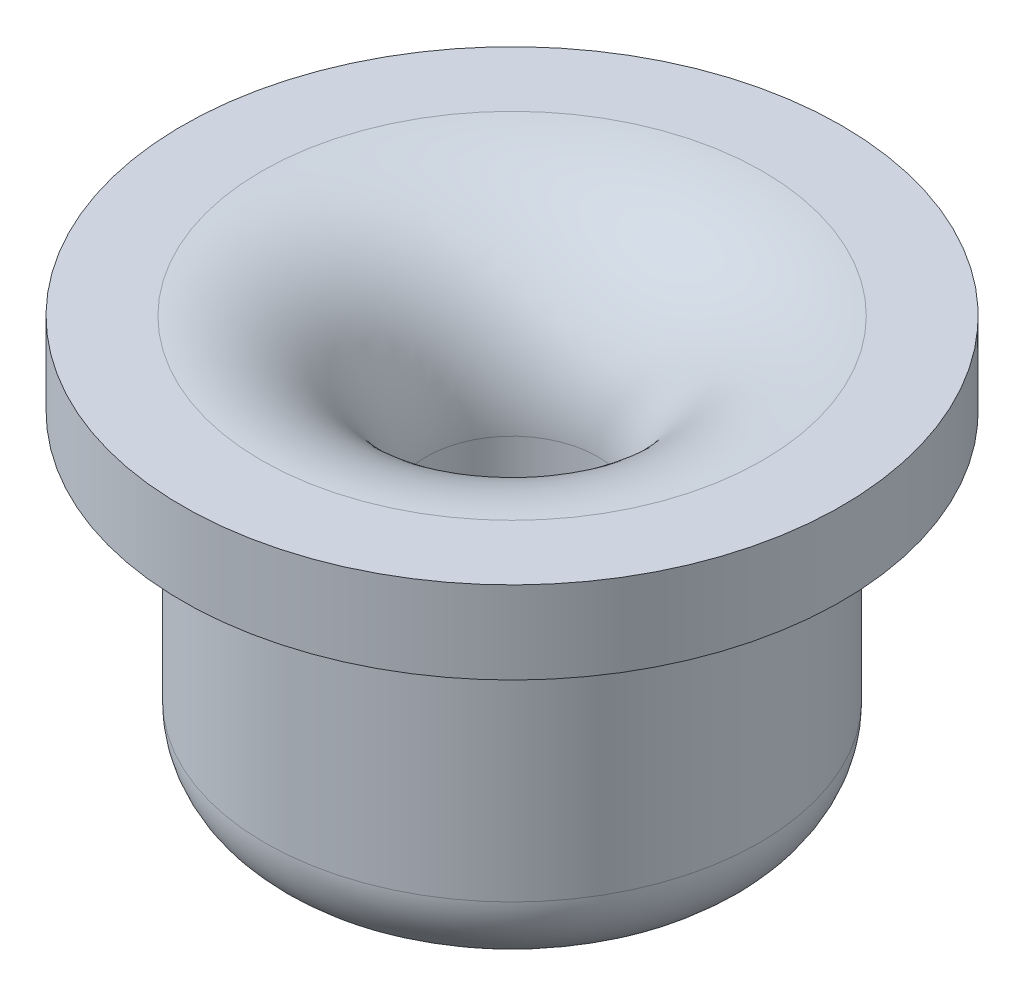
ISO-10303-21;
HEADER;
FILE_DESCRIPTION(('STEP AP214'),'2;1');
FILE_NAME('part.step','',(''),(''),'','','');
FILE_SCHEMA(('AUTOMOTIVE_DESIGN { 1 0 10303 214 1 1 1 1 }'));
ENDSEC;
DATA;
#1=APPLICATION_CONTEXT('core data for automotive mechanical design processes');
#2=APPLICATION_PROTOCOL_DEFINITION('international standard','automotive_design',2000,#1);
#3=PRODUCT_CONTEXT('',#1,'mechanical');
#4=PRODUCT('Part','Part','',(#3));
#5=PRODUCT_RELATED_PRODUCT_CATEGORY('part','',(#4));
#6=PRODUCT_DEFINITION_FORMATION('','',#4);
#7=PRODUCT_DEFINITION_CONTEXT('part definition',#1,'design');
#8=PRODUCT_DEFINITION('design','',#6,#7);
#9=PRODUCT_DEFINITION_SHAPE('','',#8);
#10=(LENGTH_UNIT() NAMED_UNIT(*) SI_UNIT(.MILLI.,.METRE.));
#11=(NAMED_UNIT(*) PLANE_ANGLE_UNIT() SI_UNIT($,.RADIAN.));
#12=(NAMED_UNIT(*) SI_UNIT($,.STERADIAN.) SOLID_ANGLE_UNIT());
#13=UNCERTAINTY_MEASURE_WITH_UNIT(LENGTH_MEASURE(1.E-05),#10,'distance_accuracy_value','');
#14=(GEOMETRIC_REPRESENTATION_CONTEXT(3) GLOBAL_UNCERTAINTY_ASSIGNED_CONTEXT((#13)) GLOBAL_UNIT_ASSIGNED_CONTEXT((#10,
#11,#12)) REPRESENTATION_CONTEXT('',''));
#15=CARTESIAN_POINT('',(0.,0.,0.));
#16=DIRECTION('',(0.,0.,1.));
#17=DIRECTION('',(1.,0.,0.));
#18=AXIS2_PLACEMENT_3D('',#15,#16,#17);
#19=CARTESIAN_POINT('',(0.,0.,4.7625));
#20=DIRECTION('',(0.,1.,0.));
#21=DIRECTION('',(0.,0.,1.));
#22=AXIS2_PLACEMENT_3D('',#19,#20,#21);
#23=PLANE('',#22);
#24=CARTESIAN_POINT('',(0.,0.,0.));
#25=DIRECTION('',(0.,1.,0.));
#26=DIRECTION('',(0.,0.,1.));
#27=AXIS2_PLACEMENT_3D('',#24,#25,#26);
#28=CIRCLE('',#27,3.2385);
#29=CARTESIAN_POINT('',(0.,0.,3.2385));
#30=VERTEX_POINT('',#29);
#31=EDGE_CURVE('E42',#30,#30,#28,.F.);
#32=ORIENTED_EDGE('',*,*,#31,.T.);
#33=EDGE_LOOP('',(#32));
#34=FACE_BOUND('',#33,.T.);
#35=CARTESIAN_POINT('',(0.,0.,0.));
#36=DIRECTION('',(0.,1.,0.));
#37=DIRECTION('',(0.,0.,1.));
#38=AXIS2_PLACEMENT_3D('',#35,#36,#37);
#39=CIRCLE('',#38,3.175);
#40=CARTESIAN_POINT('',(0.,0.,3.175));
#41=VERTEX_POINT('',#40);
#42=EDGE_CURVE('E46',#41,#41,#39,.T.);
#43=ORIENTED_EDGE('',*,*,#42,.T.);
#44=EDGE_LOOP('',(#43));
#45=FACE_BOUND('',#44,.T.);
#46=ADVANCED_FACE('F31',(#34,#45),#23,.F.);
#47=CARTESIAN_POINT('',(0.,0.,0.));
#48=DIRECTION('',(0.,-1.,0.));
#49=DIRECTION('',(0.,0.,-1.));
#50=AXIS2_PLACEMENT_3D('',#47,#48,#49);
#51=CYLINDRICAL_SURFACE('',#50,1.651);
#52=CARTESIAN_POINT('',(0.,1.524,0.));
#53=DIRECTION('',(0.,1.,0.));
#54=DIRECTION('',(0.,0.,1.));
#55=AXIS2_PLACEMENT_3D('',#52,#53,#54);
#56=CIRCLE('',#55,1.651);
#57=CARTESIAN_POINT('',(0.,1.524,1.651));
#58=VERTEX_POINT('',#57);
#59=EDGE_CURVE('E10',#58,#58,#56,.F.);
#60=ORIENTED_EDGE('',*,*,#59,.T.);
#61=EDGE_LOOP('',(#60));
#62=FACE_BOUND('',#61,.T.);
#63=CARTESIAN_POINT('',(0.,4.7625,0.));
#64=DIRECTION('',(0.,-1.,0.));
#65=DIRECTION('',(0.,0.,-1.));
#66=AXIS2_PLACEMENT_3D('',#63,#64,#65);
#67=CIRCLE('',#66,1.651);
#68=CARTESIAN_POINT('',(0.,4.7625,-1.651));
#69=VERTEX_POINT('',#68);
#70=EDGE_CURVE('E51',#69,#69,#67,.F.);
#71=ORIENTED_EDGE('',*,*,#70,.T.);
#72=EDGE_LOOP('',(#71));
#73=FACE_BOUND('',#72,.T.);
#74=ADVANCED_FACE('F83',(#62,#73),#51,.F.);
#75=CARTESIAN_POINT('',(0.,7.9375,1.651));
#76=DIRECTION('',(0.,-1.,0.));
#77=DIRECTION('',(0.,0.,-1.));
#78=AXIS2_PLACEMENT_3D('',#75,#76,#77);
#79=PLANE('',#78);
#80=CARTESIAN_POINT('',(0.,7.9375,0.));
#81=DIRECTION('',(0.,-1.,0.));
#82=DIRECTION('',(0.,0.,-1.));
#83=AXIS2_PLACEMENT_3D('',#80,#81,#82);
#84=CIRCLE('',#83,4.826);
#85=CARTESIAN_POINT('',(0.,7.9375,-4.826));
#86=VERTEX_POINT('',#85);
#87=EDGE_CURVE('E54',#86,#86,#84,.T.);
#88=ORIENTED_EDGE('',*,*,#87,.T.);
#89=EDGE_LOOP('',(#88));
#90=FACE_BOUND('',#89,.T.);
#91=CARTESIAN_POINT('',(0.,7.9375,0.));
#92=DIRECTION('',(0.,-1.,0.));
#93=DIRECTION('',(0.,0.,-1.));
#94=AXIS2_PLACEMENT_3D('',#91,#92,#93);
#95=CIRCLE('',#94,6.35);
#96=CARTESIAN_POINT('',(0.,7.9375,-6.35));
#97=VERTEX_POINT('',#96);
#98=EDGE_CURVE('E57',#97,#97,#95,.T.);
#99=ORIENTED_EDGE('',*,*,#98,.F.);
#100=EDGE_LOOP('',(#99));
#101=FACE_BOUND('',#100,.T.);
#102=ADVANCED_FACE('F78',(#90,#101),#79,.F.);
#103=CARTESIAN_POINT('',(0.,0.,0.));
#104=DIRECTION('',(0.,-1.,0.));
#105=DIRECTION('',(0.,0.,-1.));
#106=AXIS2_PLACEMENT_3D('',#103,#104,#105);
#107=CYLINDRICAL_SURFACE('',#106,6.35);
#108=CARTESIAN_POINT('',(0.,6.35,0.));
#109=DIRECTION('',(0.,-1.,0.));
#110=DIRECTION('',(0.,0.,-1.));
#111=AXIS2_PLACEMENT_3D('',#108,#109,#110);
#112=CIRCLE('',#111,6.35);
#113=CARTESIAN_POINT('',(0.,6.35,-6.35));
#114=VERTEX_POINT('',#113);
#115=EDGE_CURVE('E60',#114,#114,#112,.T.);
#116=ORIENTED_EDGE('',*,*,#115,.F.);
#117=EDGE_LOOP('',(#116));
#118=FACE_BOUND('',#117,.T.);
#119=ORIENTED_EDGE('',*,*,#98,.T.);
#120=EDGE_LOOP('',(#119));
#121=FACE_BOUND('',#120,.T.);
#122=ADVANCED_FACE('F72',(#118,#121),#107,.T.);
#123=CARTESIAN_POINT('',(0.,6.35,6.35));
#124=DIRECTION('',(0.,1.,0.));
#125=DIRECTION('',(0.,0.,1.));
#126=AXIS2_PLACEMENT_3D('',#123,#124,#125);
#127=PLANE('',#126);
#128=CARTESIAN_POINT('',(0.,6.35,0.));
#129=DIRECTION('',(0.,-1.,0.));
#130=DIRECTION('',(0.,0.,-1.));
#131=AXIS2_PLACEMENT_3D('',#128,#129,#130);
#132=CIRCLE('',#131,4.7625);
#133=CARTESIAN_POINT('',(0.,6.35,-4.7625));
#134=VERTEX_POINT('',#133);
#135=EDGE_CURVE('E63',#134,#134,#132,.T.);
#136=ORIENTED_EDGE('',*,*,#135,.F.);
#137=EDGE_LOOP('',(#136));
#138=FACE_BOUND('',#137,.T.);
#139=ORIENTED_EDGE('',*,*,#115,.T.);
#140=EDGE_LOOP('',(#139));
#141=FACE_BOUND('',#140,.T.);
#142=ADVANCED_FACE('F69',(#138,#141),#127,.F.);
#143=CARTESIAN_POINT('',(0.,0.,0.));
#144=DIRECTION('',(0.,-1.,0.));
#145=DIRECTION('',(0.,0.,-1.));
#146=AXIS2_PLACEMENT_3D('',#143,#144,#145);
#147=CYLINDRICAL_SURFACE('',#146,4.7625);
#148=CARTESIAN_POINT('',(0.,1.524,0.));
#149=DIRECTION('',(0.,1.,0.));
#150=DIRECTION('',(0.,0.,1.));
#151=AXIS2_PLACEMENT_3D('',#148,#149,#150);
#152=CIRCLE('',#151,4.7625);
#153=CARTESIAN_POINT('',(0.,1.524,4.7625));
#154=VERTEX_POINT('',#153);
#155=EDGE_CURVE('E38',#154,#154,#152,.T.);
#156=ORIENTED_EDGE('',*,*,#155,.T.);
#157=EDGE_LOOP('',(#156));
#158=FACE_BOUND('',#157,.T.);
#159=ORIENTED_EDGE('',*,*,#135,.T.);
#160=EDGE_LOOP('',(#159));
#161=FACE_BOUND('',#160,.T.);
#162=ADVANCED_FACE('F67',(#158,#161),#147,.T.);
#163=CARTESIAN_POINT('',(0.,4.7625,0.));
#164=DIRECTION('',(0.,-1.,0.));
#165=DIRECTION('',(0.,0.,-1.));
#166=AXIS2_PLACEMENT_3D('',#163,#164,#165);
#167=TOROIDAL_SURFACE('',#166,4.826,3.175);
#168=ORIENTED_EDGE('',*,*,#70,.F.);
#169=EDGE_LOOP('',(#168));
#170=FACE_BOUND('',#169,.T.);
#171=ORIENTED_EDGE('',*,*,#87,.F.);
#172=EDGE_LOOP('',(#171));
#173=FACE_BOUND('',#172,.T.);
#174=ADVANCED_FACE('F97',(#170,#173),#167,.T.);
#175=CARTESIAN_POINT('',(0.,1.524,0.));
#176=DIRECTION('',(0.,1.,0.));
#177=DIRECTION('',(0.,0.,1.));
#178=AXIS2_PLACEMENT_3D('',#175,#176,#177);
#179=TOROIDAL_SURFACE('',#178,3.2385,1.524);
#180=ORIENTED_EDGE('',*,*,#155,.F.);
#181=EDGE_LOOP('',(#180));
#182=FACE_BOUND('',#181,.T.);
#183=ORIENTED_EDGE('',*,*,#31,.F.);
#184=EDGE_LOOP('',(#183));
#185=FACE_BOUND('',#184,.T.);
#186=ADVANCED_FACE('F99',(#182,#185),#179,.T.);
#187=CARTESIAN_POINT('',(0.,1.524,0.));
#188=DIRECTION('',(0.,1.,0.));
#189=DIRECTION('',(0.,0.,1.));
#190=AXIS2_PLACEMENT_3D('',#187,#188,#189);
#191=TOROIDAL_SURFACE('',#190,3.175,1.524);
#192=ORIENTED_EDGE('',*,*,#42,.F.);
#193=EDGE_LOOP('',(#192));
#194=FACE_BOUND('',#193,.T.);
#195=ORIENTED_EDGE('',*,*,#59,.F.);
#196=EDGE_LOOP('',(#195));
#197=FACE_BOUND('',#196,.T.);
#198=ADVANCED_FACE('F33',(#194,#197),#191,.T.);
#199=CLOSED_SHELL('',(#46,#74,#102,#122,#142,#162,#174,#186,#198));
#200=MANIFOLD_SOLID_BREP('B2',#199);
#201=ADVANCED_BREP_SHAPE_REPRESENTATION('',(#18,#200),#14);
#202=SHAPE_DEFINITION_REPRESENTATION(#9,#201);
ENDSEC;
END-ISO-10303-21;
